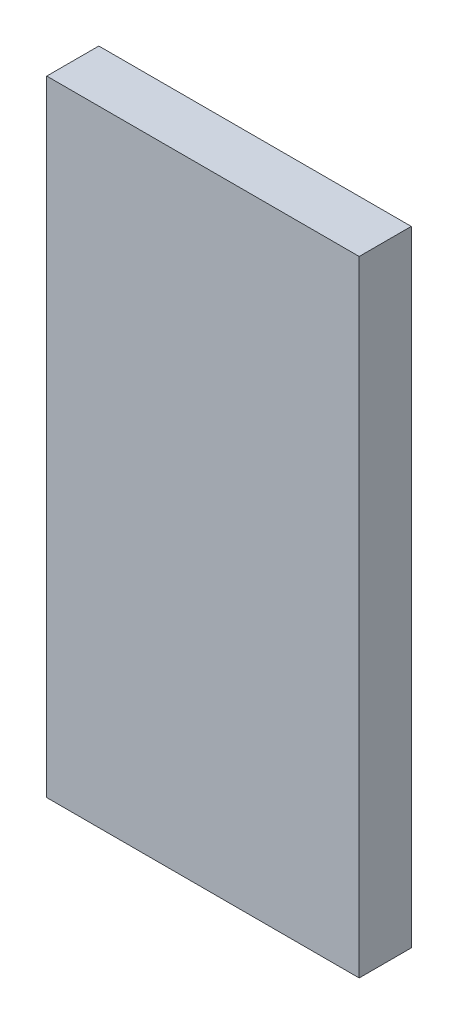
ISO-10303-21;
HEADER;
FILE_DESCRIPTION(('STEP AP214'),'2;1');
FILE_NAME('part.step','',(''),(''),'','','');
FILE_SCHEMA(('AUTOMOTIVE_DESIGN { 1 0 10303 214 1 1 1 1 }'));
ENDSEC;
DATA;
#1=APPLICATION_CONTEXT('core data for automotive mechanical design processes');
#2=APPLICATION_PROTOCOL_DEFINITION('international standard','automotive_design',2000,#1);
#3=PRODUCT_CONTEXT('',#1,'mechanical');
#4=PRODUCT('Part','Part','',(#3));
#5=PRODUCT_RELATED_PRODUCT_CATEGORY('part','',(#4));
#6=PRODUCT_DEFINITION_FORMATION('','',#4);
#7=PRODUCT_DEFINITION_CONTEXT('part definition',#1,'design');
#8=PRODUCT_DEFINITION('design','',#6,#7);
#9=PRODUCT_DEFINITION_SHAPE('','',#8);
#10=(LENGTH_UNIT() NAMED_UNIT(*) SI_UNIT(.MILLI.,.METRE.));
#11=(NAMED_UNIT(*) PLANE_ANGLE_UNIT() SI_UNIT($,.RADIAN.));
#12=(NAMED_UNIT(*) SI_UNIT($,.STERADIAN.) SOLID_ANGLE_UNIT());
#13=UNCERTAINTY_MEASURE_WITH_UNIT(LENGTH_MEASURE(1.E-05),#10,'distance_accuracy_value','');
#14=(GEOMETRIC_REPRESENTATION_CONTEXT(3) GLOBAL_UNCERTAINTY_ASSIGNED_CONTEXT((#13)) GLOBAL_UNIT_ASSIGNED_CONTEXT((#10,
#11,#12)) REPRESENTATION_CONTEXT('',''));
#15=CARTESIAN_POINT('',(0.,0.,0.));
#16=DIRECTION('',(0.,0.,1.));
#17=DIRECTION('',(1.,0.,0.));
#18=AXIS2_PLACEMENT_3D('',#15,#16,#17);
#19=CARTESIAN_POINT('',(76.2,-152.4,25.4));
#20=DIRECTION('',(-1.,0.,0.));
#21=DIRECTION('',(0.,0.,1.));
#22=AXIS2_PLACEMENT_3D('',#19,#20,#21);
#23=PLANE('',#22);
#24=DIRECTION('',(0.,1.,0.));
#25=VECTOR('',#24,1.);
#26=CARTESIAN_POINT('',(76.2,-152.4,0.));
#27=LINE('',#26,#25);
#28=CARTESIAN_POINT('',(76.2,-152.4,0.));
#29=VERTEX_POINT('',#28);
#30=CARTESIAN_POINT('',(76.2,152.4,0.));
#31=VERTEX_POINT('',#30);
#32=EDGE_CURVE('E96',#29,#31,#27,.T.);
#33=ORIENTED_EDGE('',*,*,#32,.T.);
#34=DIRECTION('',(0.,0.,-1.));
#35=VECTOR('',#34,1.);
#36=CARTESIAN_POINT('',(76.2,152.4,25.4));
#37=LINE('',#36,#35);
#38=CARTESIAN_POINT('',(76.2,152.4,25.4));
#39=VERTEX_POINT('',#38);
#40=EDGE_CURVE('E11',#39,#31,#37,.T.);
#41=ORIENTED_EDGE('',*,*,#40,.F.);
#42=DIRECTION('',(0.,1.,0.));
#43=VECTOR('',#42,1.);
#44=CARTESIAN_POINT('',(76.2,-152.4,25.4));
#45=LINE('',#44,#43);
#46=CARTESIAN_POINT('',(76.2,-152.4,25.4));
#47=VERTEX_POINT('',#46);
#48=EDGE_CURVE('E84',#47,#39,#45,.T.);
#49=ORIENTED_EDGE('',*,*,#48,.F.);
#50=DIRECTION('',(0.,0.,-1.));
#51=VECTOR('',#50,1.);
#52=CARTESIAN_POINT('',(76.2,-152.4,25.4));
#53=LINE('',#52,#51);
#54=EDGE_CURVE('E92',#47,#29,#53,.T.);
#55=ORIENTED_EDGE('',*,*,#54,.T.);
#56=EDGE_LOOP('',(#33,#41,#49,#55));
#57=FACE_BOUND('',#56,.T.);
#58=ADVANCED_FACE('F33',(#57),#23,.F.);
#59=CARTESIAN_POINT('',(-76.2,152.4,25.4));
#60=DIRECTION('',(0.,-1.,0.));
#61=DIRECTION('',(0.,0.,-1.));
#62=AXIS2_PLACEMENT_3D('',#59,#60,#61);
#63=PLANE('',#62);
#64=DIRECTION('',(-1.,0.,0.));
#65=VECTOR('',#64,1.);
#66=CARTESIAN_POINT('',(-76.2,152.4,0.));
#67=LINE('',#66,#65);
#68=CARTESIAN_POINT('',(-76.2,152.4,0.));
#69=VERTEX_POINT('',#68);
#70=EDGE_CURVE('E88',#31,#69,#67,.T.);
#71=ORIENTED_EDGE('',*,*,#70,.T.);
#72=DIRECTION('',(0.,0.,-1.));
#73=VECTOR('',#72,1.);
#74=CARTESIAN_POINT('',(-76.2,152.4,25.4));
#75=LINE('',#74,#73);
#76=CARTESIAN_POINT('',(-76.2,152.4,25.4));
#77=VERTEX_POINT('',#76);
#78=EDGE_CURVE('E41',#77,#69,#75,.T.);
#79=ORIENTED_EDGE('',*,*,#78,.F.);
#80=DIRECTION('',(-1.,0.,0.));
#81=VECTOR('',#80,1.);
#82=CARTESIAN_POINT('',(-76.2,152.4,25.4));
#83=LINE('',#82,#81);
#84=EDGE_CURVE('E79',#39,#77,#83,.T.);
#85=ORIENTED_EDGE('',*,*,#84,.F.);
#86=ORIENTED_EDGE('',*,*,#40,.T.);
#87=EDGE_LOOP('',(#71,#79,#85,#86));
#88=FACE_BOUND('',#87,.T.);
#89=ADVANCED_FACE('F87',(#88),#63,.F.);
#90=CARTESIAN_POINT('',(-76.2,-152.4,25.4));
#91=DIRECTION('',(1.,0.,0.));
#92=DIRECTION('',(0.,0.,-1.));
#93=AXIS2_PLACEMENT_3D('',#90,#91,#92);
#94=PLANE('',#93);
#95=DIRECTION('',(0.,-1.,0.));
#96=VECTOR('',#95,1.);
#97=CARTESIAN_POINT('',(-76.2,-152.4,0.));
#98=LINE('',#97,#96);
#99=CARTESIAN_POINT('',(-76.2,-152.4,0.));
#100=VERTEX_POINT('',#99);
#101=EDGE_CURVE('E66',#69,#100,#98,.T.);
#102=ORIENTED_EDGE('',*,*,#101,.T.);
#103=DIRECTION('',(0.,0.,-1.));
#104=VECTOR('',#103,1.);
#105=CARTESIAN_POINT('',(-76.2,-152.4,25.4));
#106=LINE('',#105,#104);
#107=CARTESIAN_POINT('',(-76.2,-152.4,25.4));
#108=VERTEX_POINT('',#107);
#109=EDGE_CURVE('E89',#108,#100,#106,.T.);
#110=ORIENTED_EDGE('',*,*,#109,.F.);
#111=DIRECTION('',(0.,-1.,0.));
#112=VECTOR('',#111,1.);
#113=CARTESIAN_POINT('',(-76.2,-152.4,25.4));
#114=LINE('',#113,#112);
#115=EDGE_CURVE('E82',#77,#108,#114,.T.);
#116=ORIENTED_EDGE('',*,*,#115,.F.);
#117=ORIENTED_EDGE('',*,*,#78,.T.);
#118=EDGE_LOOP('',(#102,#110,#116,#117));
#119=FACE_BOUND('',#118,.T.);
#120=ADVANCED_FACE('F90',(#119),#94,.F.);
#121=CARTESIAN_POINT('',(-76.2,-152.4,25.4));
#122=DIRECTION('',(0.,1.,0.));
#123=DIRECTION('',(0.,0.,1.));
#124=AXIS2_PLACEMENT_3D('',#121,#122,#123);
#125=PLANE('',#124);
#126=DIRECTION('',(1.,0.,0.));
#127=VECTOR('',#126,1.);
#128=CARTESIAN_POINT('',(-76.2,-152.4,0.));
#129=LINE('',#128,#127);
#130=EDGE_CURVE('E72',#100,#29,#129,.T.);
#131=ORIENTED_EDGE('',*,*,#130,.T.);
#132=ORIENTED_EDGE('',*,*,#54,.F.);
#133=DIRECTION('',(1.,0.,0.));
#134=VECTOR('',#133,1.);
#135=CARTESIAN_POINT('',(-76.2,-152.4,25.4));
#136=LINE('',#135,#134);
#137=EDGE_CURVE('E49',#108,#47,#136,.T.);
#138=ORIENTED_EDGE('',*,*,#137,.F.);
#139=ORIENTED_EDGE('',*,*,#109,.T.);
#140=EDGE_LOOP('',(#131,#132,#138,#139));
#141=FACE_BOUND('',#140,.T.);
#142=ADVANCED_FACE('F103',(#141),#125,.F.);
#143=CARTESIAN_POINT('',(0.,0.,25.4));
#144=DIRECTION('',(0.,0.,-1.));
#145=DIRECTION('',(-1.,0.,0.));
#146=AXIS2_PLACEMENT_3D('',#143,#144,#145);
#147=PLANE('',#146);
#148=ORIENTED_EDGE('',*,*,#48,.T.);
#149=ORIENTED_EDGE('',*,*,#84,.T.);
#150=ORIENTED_EDGE('',*,*,#115,.T.);
#151=ORIENTED_EDGE('',*,*,#137,.T.);
#152=EDGE_LOOP('',(#148,#149,#150,#151));
#153=FACE_BOUND('',#152,.T.);
#154=ADVANCED_FACE('F80',(#153),#147,.F.);
#155=CARTESIAN_POINT('',(0.,0.,0.));
#156=DIRECTION('',(0.,0.,-1.));
#157=DIRECTION('',(-1.,0.,0.));
#158=AXIS2_PLACEMENT_3D('',#155,#156,#157);
#159=PLANE('',#158);
#160=ORIENTED_EDGE('',*,*,#32,.F.);
#161=ORIENTED_EDGE('',*,*,#130,.F.);
#162=ORIENTED_EDGE('',*,*,#101,.F.);
#163=ORIENTED_EDGE('',*,*,#70,.F.);
#164=EDGE_LOOP('',(#160,#161,#162,#163));
#165=FACE_BOUND('',#164,.T.);
#166=ADVANCED_FACE('F106',(#165),#159,.T.);
#167=CLOSED_SHELL('',(#58,#89,#120,#142,#154,#166));
#168=MANIFOLD_SOLID_BREP('B2',#167);
#169=ADVANCED_BREP_SHAPE_REPRESENTATION('',(#18,#168),#14);
#170=SHAPE_DEFINITION_REPRESENTATION(#9,#169);
ENDSEC;
END-ISO-10303-21;
